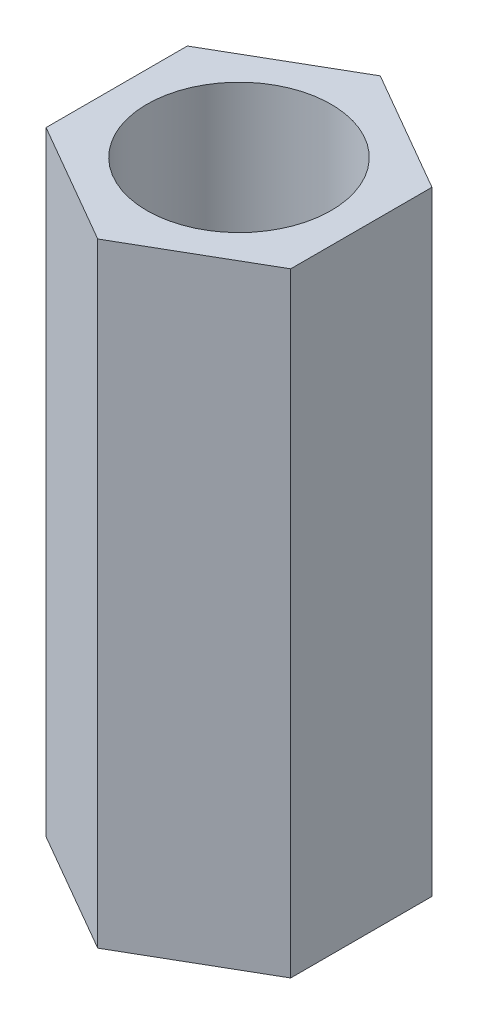
ISO-10303-21;
HEADER;
FILE_DESCRIPTION(('STEP AP214'),'2;1');
FILE_NAME('part.step','',(''),(''),'','','');
FILE_SCHEMA(('AUTOMOTIVE_DESIGN { 1 0 10303 214 1 1 1 1 }'));
ENDSEC;
DATA;
#1=APPLICATION_CONTEXT('core data for automotive mechanical design processes');
#2=APPLICATION_PROTOCOL_DEFINITION('international standard','automotive_design',2000,#1);
#3=PRODUCT_CONTEXT('',#1,'mechanical');
#4=PRODUCT('Part','Part','',(#3));
#5=PRODUCT_RELATED_PRODUCT_CATEGORY('part','',(#4));
#6=PRODUCT_DEFINITION_FORMATION('','',#4);
#7=PRODUCT_DEFINITION_CONTEXT('part definition',#1,'design');
#8=PRODUCT_DEFINITION('design','',#6,#7);
#9=PRODUCT_DEFINITION_SHAPE('','',#8);
#10=(LENGTH_UNIT() NAMED_UNIT(*) SI_UNIT(.MILLI.,.METRE.));
#11=(NAMED_UNIT(*) PLANE_ANGLE_UNIT() SI_UNIT($,.RADIAN.));
#12=(NAMED_UNIT(*) SI_UNIT($,.STERADIAN.) SOLID_ANGLE_UNIT());
#13=UNCERTAINTY_MEASURE_WITH_UNIT(LENGTH_MEASURE(1.E-05),#10,'distance_accuracy_value','');
#14=(GEOMETRIC_REPRESENTATION_CONTEXT(3) GLOBAL_UNCERTAINTY_ASSIGNED_CONTEXT((#13)) GLOBAL_UNIT_ASSIGNED_CONTEXT((#10,
#11,#12)) REPRESENTATION_CONTEXT('',''));
#15=CARTESIAN_POINT('',(0.,0.,0.));
#16=DIRECTION('',(0.,0.,1.));
#17=DIRECTION('',(1.,0.,0.));
#18=AXIS2_PLACEMENT_3D('',#15,#16,#17);
#19=CARTESIAN_POINT('',(0.,10.,0.));
#20=DIRECTION('',(0.,1.,0.));
#21=DIRECTION('',(0.,0.,1.));
#22=AXIS2_PLACEMENT_3D('',#19,#20,#21);
#23=PLANE('',#22);
#24=DIRECTION('',(0.,0.,-1.));
#25=VECTOR('',#24,1.);
#26=CARTESIAN_POINT('',(1.99185842870422,10.,1.14999999999998));
#27=LINE('',#26,#25);
#28=CARTESIAN_POINT('',(1.99185842870422,10.,1.14999999999998));
#29=VERTEX_POINT('',#28);
#30=CARTESIAN_POINT('',(1.9918584287042,10.,-1.15000000000002));
#31=VERTEX_POINT('',#30);
#32=EDGE_CURVE('E137',#29,#31,#27,.T.);
#33=ORIENTED_EDGE('',*,*,#32,.T.);
#34=DIRECTION('',(-0.866025403784443,0.,-0.499999999999992));
#35=VECTOR('',#34,1.);
#36=CARTESIAN_POINT('',(1.9918584287042,10.,-1.15000000000002));
#37=LINE('',#36,#35);
#38=CARTESIAN_POINT('',(0.,10.,-2.3));
#39=VERTEX_POINT('',#38);
#40=EDGE_CURVE('E95',#31,#39,#37,.T.);
#41=ORIENTED_EDGE('',*,*,#40,.T.);
#42=DIRECTION('',(-0.866025403784434,0.,0.500000000000008));
#43=VECTOR('',#42,1.);
#44=CARTESIAN_POINT('',(0.,10.,-2.3));
#45=LINE('',#44,#43);
#46=CARTESIAN_POINT('',(-1.99185842870422,10.,-1.14999999999998));
#47=VERTEX_POINT('',#46);
#48=EDGE_CURVE('E108',#39,#47,#45,.T.);
#49=ORIENTED_EDGE('',*,*,#48,.T.);
#50=DIRECTION('',(0.,0.,1.));
#51=VECTOR('',#50,1.);
#52=CARTESIAN_POINT('',(-1.99185842870422,10.,-1.14999999999998));
#53=LINE('',#52,#51);
#54=CARTESIAN_POINT('',(-1.9918584287042,10.,1.15000000000002));
#55=VERTEX_POINT('',#54);
#56=EDGE_CURVE('E102',#47,#55,#53,.T.);
#57=ORIENTED_EDGE('',*,*,#56,.T.);
#58=DIRECTION('',(0.866025403784443,0.,0.499999999999992));
#59=VECTOR('',#58,1.);
#60=CARTESIAN_POINT('',(-1.9918584287042,10.,1.15000000000002));
#61=LINE('',#60,#59);
#62=CARTESIAN_POINT('',(0.,10.,2.3));
#63=VERTEX_POINT('',#62);
#64=EDGE_CURVE('E106',#55,#63,#61,.T.);
#65=ORIENTED_EDGE('',*,*,#64,.T.);
#66=DIRECTION('',(0.866025403784434,0.,-0.500000000000008));
#67=VECTOR('',#66,1.);
#68=CARTESIAN_POINT('',(0.,10.,2.3));
#69=LINE('',#68,#67);
#70=EDGE_CURVE('E58',#63,#29,#69,.T.);
#71=ORIENTED_EDGE('',*,*,#70,.T.);
#72=EDGE_LOOP('',(#33,#41,#49,#57,#65,#71));
#73=FACE_BOUND('',#72,.T.);
#74=CARTESIAN_POINT('',(0.,10.,0.));
#75=DIRECTION('',(0.,1.,0.));
#76=DIRECTION('',(0.,0.,1.));
#77=AXIS2_PLACEMENT_3D('',#74,#75,#76);
#78=CIRCLE('',#77,1.5);
#79=CARTESIAN_POINT('',(0.,10.,1.5));
#80=VERTEX_POINT('',#79);
#81=EDGE_CURVE('E130',#80,#80,#78,.T.);
#82=ORIENTED_EDGE('',*,*,#81,.F.);
#83=EDGE_LOOP('',(#82));
#84=FACE_BOUND('',#83,.T.);
#85=ADVANCED_FACE('F41',(#73,#84),#23,.T.);
#86=CARTESIAN_POINT('',(0.,0.,0.));
#87=DIRECTION('',(0.,1.,0.));
#88=DIRECTION('',(0.,0.,1.));
#89=AXIS2_PLACEMENT_3D('',#86,#87,#88);
#90=PLANE('',#89);
#91=DIRECTION('',(0.,0.,-1.));
#92=VECTOR('',#91,1.);
#93=CARTESIAN_POINT('',(1.99185842870422,0.,1.14999999999998));
#94=LINE('',#93,#92);
#95=CARTESIAN_POINT('',(1.99185842870422,0.,1.14999999999998));
#96=VERTEX_POINT('',#95);
#97=CARTESIAN_POINT('',(1.9918584287042,0.,-1.15000000000002));
#98=VERTEX_POINT('',#97);
#99=EDGE_CURVE('E126',#96,#98,#94,.T.);
#100=ORIENTED_EDGE('',*,*,#99,.F.);
#101=DIRECTION('',(0.866025403784434,0.,-0.500000000000008));
#102=VECTOR('',#101,1.);
#103=CARTESIAN_POINT('',(0.,0.,2.3));
#104=LINE('',#103,#102);
#105=CARTESIAN_POINT('',(0.,0.,2.3));
#106=VERTEX_POINT('',#105);
#107=EDGE_CURVE('E87',#106,#96,#104,.T.);
#108=ORIENTED_EDGE('',*,*,#107,.F.);
#109=DIRECTION('',(0.866025403784443,0.,0.499999999999992));
#110=VECTOR('',#109,1.);
#111=CARTESIAN_POINT('',(-1.9918584287042,0.,1.15000000000002));
#112=LINE('',#111,#110);
#113=CARTESIAN_POINT('',(-1.9918584287042,0.,1.15000000000002));
#114=VERTEX_POINT('',#113);
#115=EDGE_CURVE('E81',#114,#106,#112,.T.);
#116=ORIENTED_EDGE('',*,*,#115,.F.);
#117=DIRECTION('',(0.,0.,1.));
#118=VECTOR('',#117,1.);
#119=CARTESIAN_POINT('',(-1.99185842870422,0.,-1.14999999999998));
#120=LINE('',#119,#118);
#121=CARTESIAN_POINT('',(-1.99185842870422,0.,-1.14999999999998));
#122=VERTEX_POINT('',#121);
#123=EDGE_CURVE('E116',#122,#114,#120,.T.);
#124=ORIENTED_EDGE('',*,*,#123,.F.);
#125=DIRECTION('',(-0.866025403784434,0.,0.500000000000008));
#126=VECTOR('',#125,1.);
#127=CARTESIAN_POINT('',(0.,0.,-2.3));
#128=LINE('',#127,#126);
#129=CARTESIAN_POINT('',(0.,0.,-2.3));
#130=VERTEX_POINT('',#129);
#131=EDGE_CURVE('E132',#130,#122,#128,.T.);
#132=ORIENTED_EDGE('',*,*,#131,.F.);
#133=DIRECTION('',(-0.866025403784443,0.,-0.499999999999992));
#134=VECTOR('',#133,1.);
#135=CARTESIAN_POINT('',(1.9918584287042,0.,-1.15000000000002));
#136=LINE('',#135,#134);
#137=EDGE_CURVE('E129',#98,#130,#136,.T.);
#138=ORIENTED_EDGE('',*,*,#137,.F.);
#139=EDGE_LOOP('',(#100,#108,#116,#124,#132,#138));
#140=FACE_BOUND('',#139,.T.);
#141=CARTESIAN_POINT('',(0.,0.,0.));
#142=DIRECTION('',(0.,1.,0.));
#143=DIRECTION('',(0.,0.,1.));
#144=AXIS2_PLACEMENT_3D('',#141,#142,#143);
#145=CIRCLE('',#144,1.5);
#146=CARTESIAN_POINT('',(0.,0.,1.5));
#147=VERTEX_POINT('',#146);
#148=EDGE_CURVE('E230',#147,#147,#145,.T.);
#149=ORIENTED_EDGE('',*,*,#148,.T.);
#150=EDGE_LOOP('',(#149));
#151=FACE_BOUND('',#150,.T.);
#152=ADVANCED_FACE('F146',(#140,#151),#90,.F.);
#153=CARTESIAN_POINT('',(1.99185842870422,10.,1.14999999999998));
#154=DIRECTION('',(-1.,0.,0.));
#155=DIRECTION('',(0.,0.,1.));
#156=AXIS2_PLACEMENT_3D('',#153,#154,#155);
#157=PLANE('',#156);
#158=ORIENTED_EDGE('',*,*,#99,.T.);
#159=DIRECTION('',(0.,-1.,0.));
#160=VECTOR('',#159,1.);
#161=CARTESIAN_POINT('',(1.9918584287042,10.,-1.15000000000002));
#162=LINE('',#161,#160);
#163=EDGE_CURVE('E11',#31,#98,#162,.T.);
#164=ORIENTED_EDGE('',*,*,#163,.F.);
#165=ORIENTED_EDGE('',*,*,#32,.F.);
#166=DIRECTION('',(0.,-1.,0.));
#167=VECTOR('',#166,1.);
#168=CARTESIAN_POINT('',(1.99185842870422,10.,1.14999999999998));
#169=LINE('',#168,#167);
#170=EDGE_CURVE('E122',#29,#96,#169,.T.);
#171=ORIENTED_EDGE('',*,*,#170,.T.);
#172=EDGE_LOOP('',(#158,#164,#165,#171));
#173=FACE_BOUND('',#172,.T.);
#174=ADVANCED_FACE('F43',(#173),#157,.F.);
#175=CARTESIAN_POINT('',(1.9918584287042,10.,-1.15000000000002));
#176=DIRECTION('',(-0.499999999999992,0.,0.866025403784443));
#177=DIRECTION('',(0.866025403784443,0.,0.499999999999992));
#178=AXIS2_PLACEMENT_3D('',#175,#176,#177);
#179=PLANE('',#178);
#180=ORIENTED_EDGE('',*,*,#137,.T.);
#181=DIRECTION('',(0.,-1.,0.));
#182=VECTOR('',#181,1.);
#183=CARTESIAN_POINT('',(0.,10.,-2.3));
#184=LINE('',#183,#182);
#185=EDGE_CURVE('E50',#39,#130,#184,.T.);
#186=ORIENTED_EDGE('',*,*,#185,.F.);
#187=ORIENTED_EDGE('',*,*,#40,.F.);
#188=ORIENTED_EDGE('',*,*,#163,.T.);
#189=EDGE_LOOP('',(#180,#186,#187,#188));
#190=FACE_BOUND('',#189,.T.);
#191=ADVANCED_FACE('F171',(#190),#179,.F.);
#192=CARTESIAN_POINT('',(0.,10.,-2.3));
#193=DIRECTION('',(0.500000000000008,0.,0.866025403784434));
#194=DIRECTION('',(0.866025403784434,0.,-0.500000000000008));
#195=AXIS2_PLACEMENT_3D('',#192,#193,#194);
#196=PLANE('',#195);
#197=ORIENTED_EDGE('',*,*,#131,.T.);
#198=DIRECTION('',(0.,-1.,0.));
#199=VECTOR('',#198,1.);
#200=CARTESIAN_POINT('',(-1.99185842870422,10.,-1.14999999999998));
#201=LINE('',#200,#199);
#202=EDGE_CURVE('E117',#47,#122,#201,.T.);
#203=ORIENTED_EDGE('',*,*,#202,.F.);
#204=ORIENTED_EDGE('',*,*,#48,.F.);
#205=ORIENTED_EDGE('',*,*,#185,.T.);
#206=EDGE_LOOP('',(#197,#203,#204,#205));
#207=FACE_BOUND('',#206,.T.);
#208=ADVANCED_FACE('F143',(#207),#196,.F.);
#209=CARTESIAN_POINT('',(-1.99185842870422,10.,-1.14999999999998));
#210=DIRECTION('',(1.,0.,0.));
#211=DIRECTION('',(0.,0.,-1.));
#212=AXIS2_PLACEMENT_3D('',#209,#210,#211);
#213=PLANE('',#212);
#214=ORIENTED_EDGE('',*,*,#123,.T.);
#215=DIRECTION('',(0.,-1.,0.));
#216=VECTOR('',#215,1.);
#217=CARTESIAN_POINT('',(-1.9918584287042,10.,1.15000000000002));
#218=LINE('',#217,#216);
#219=EDGE_CURVE('E113',#55,#114,#218,.T.);
#220=ORIENTED_EDGE('',*,*,#219,.F.);
#221=ORIENTED_EDGE('',*,*,#56,.F.);
#222=ORIENTED_EDGE('',*,*,#202,.T.);
#223=EDGE_LOOP('',(#214,#220,#221,#222));
#224=FACE_BOUND('',#223,.T.);
#225=ADVANCED_FACE('F114',(#224),#213,.F.);
#226=CARTESIAN_POINT('',(-1.9918584287042,10.,1.15000000000002));
#227=DIRECTION('',(0.499999999999992,0.,-0.866025403784443));
#228=DIRECTION('',(-0.866025403784443,0.,-0.499999999999992));
#229=AXIS2_PLACEMENT_3D('',#226,#227,#228);
#230=PLANE('',#229);
#231=ORIENTED_EDGE('',*,*,#115,.T.);
#232=DIRECTION('',(0.,-1.,0.));
#233=VECTOR('',#232,1.);
#234=CARTESIAN_POINT('',(0.,10.,2.3));
#235=LINE('',#234,#233);
#236=EDGE_CURVE('E118',#63,#106,#235,.T.);
#237=ORIENTED_EDGE('',*,*,#236,.F.);
#238=ORIENTED_EDGE('',*,*,#64,.F.);
#239=ORIENTED_EDGE('',*,*,#219,.T.);
#240=EDGE_LOOP('',(#231,#237,#238,#239));
#241=FACE_BOUND('',#240,.T.);
#242=ADVANCED_FACE('F120',(#241),#230,.F.);
#243=CARTESIAN_POINT('',(0.,10.,2.3));
#244=DIRECTION('',(-0.500000000000008,0.,-0.866025403784434));
#245=DIRECTION('',(-0.866025403784434,0.,0.500000000000008));
#246=AXIS2_PLACEMENT_3D('',#243,#244,#245);
#247=PLANE('',#246);
#248=ORIENTED_EDGE('',*,*,#107,.T.);
#249=ORIENTED_EDGE('',*,*,#170,.F.);
#250=ORIENTED_EDGE('',*,*,#70,.F.);
#251=ORIENTED_EDGE('',*,*,#236,.T.);
#252=EDGE_LOOP('',(#248,#249,#250,#251));
#253=FACE_BOUND('',#252,.T.);
#254=ADVANCED_FACE('F151',(#253),#247,.F.);
#255=CARTESIAN_POINT('',(0.,10.,0.));
#256=DIRECTION('',(0.,-1.,0.));
#257=DIRECTION('',(0.,0.,-1.));
#258=AXIS2_PLACEMENT_3D('',#255,#256,#257);
#259=CYLINDRICAL_SURFACE('',#258,1.5);
#260=ORIENTED_EDGE('',*,*,#81,.T.);
#261=EDGE_LOOP('',(#260));
#262=FACE_BOUND('',#261,.T.);
#263=ORIENTED_EDGE('',*,*,#148,.F.);
#264=EDGE_LOOP('',(#263));
#265=FACE_BOUND('',#264,.T.);
#266=ADVANCED_FACE('F153',(#262,#265),#259,.F.);
#267=CLOSED_SHELL('',(#85,#152,#174,#191,#208,#225,#242,#254,#266));
#268=MANIFOLD_SOLID_BREP('B2',#267);
#269=ADVANCED_BREP_SHAPE_REPRESENTATION('',(#18,#268),#14);
#270=SHAPE_DEFINITION_REPRESENTATION(#9,#269);
ENDSEC;
END-ISO-10303-21;
